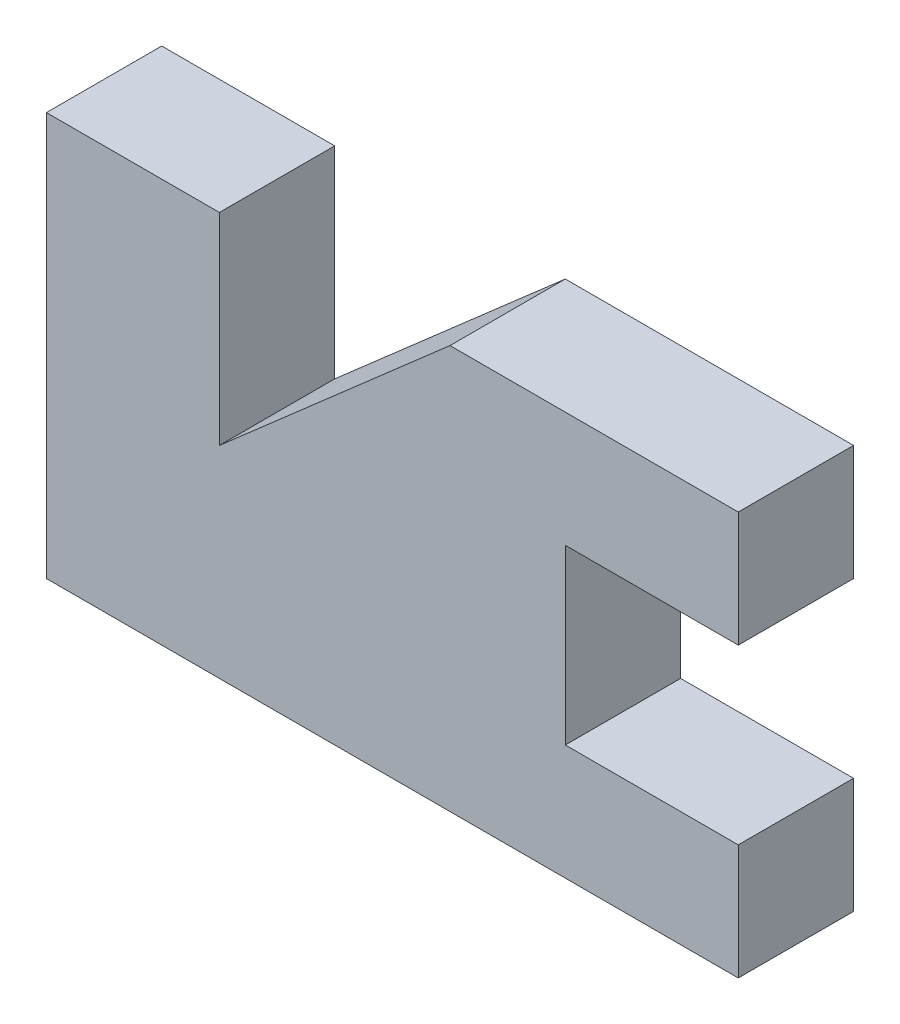
ISO-10303-21;
HEADER;
FILE_DESCRIPTION(('STEP AP214'),'2;1');
FILE_NAME('part.step','',(''),(''),'','','');
FILE_SCHEMA(('AUTOMOTIVE_DESIGN { 1 0 10303 214 1 1 1 1 }'));
ENDSEC;
DATA;
#1=APPLICATION_CONTEXT('core data for automotive mechanical design processes');
#2=APPLICATION_PROTOCOL_DEFINITION('international standard','automotive_design',2000,#1);
#3=PRODUCT_CONTEXT('',#1,'mechanical');
#4=PRODUCT('Part','Part','',(#3));
#5=PRODUCT_RELATED_PRODUCT_CATEGORY('part','',(#4));
#6=PRODUCT_DEFINITION_FORMATION('','',#4);
#7=PRODUCT_DEFINITION_CONTEXT('part definition',#1,'design');
#8=PRODUCT_DEFINITION('design','',#6,#7);
#9=PRODUCT_DEFINITION_SHAPE('','',#8);
#10=(LENGTH_UNIT() NAMED_UNIT(*) SI_UNIT(.MILLI.,.METRE.));
#11=(NAMED_UNIT(*) PLANE_ANGLE_UNIT() SI_UNIT($,.RADIAN.));
#12=(NAMED_UNIT(*) SI_UNIT($,.STERADIAN.) SOLID_ANGLE_UNIT());
#13=UNCERTAINTY_MEASURE_WITH_UNIT(LENGTH_MEASURE(1.E-05),#10,'distance_accuracy_value','');
#14=(GEOMETRIC_REPRESENTATION_CONTEXT(3) GLOBAL_UNCERTAINTY_ASSIGNED_CONTEXT((#13)) GLOBAL_UNIT_ASSIGNED_CONTEXT((#10,
#11,#12)) REPRESENTATION_CONTEXT('',''));
#15=CARTESIAN_POINT('',(0.,0.,0.));
#16=DIRECTION('',(0.,0.,1.));
#17=DIRECTION('',(1.,0.,0.));
#18=AXIS2_PLACEMENT_3D('',#15,#16,#17);
#19=CARTESIAN_POINT('',(300.,75.,100.));
#20=DIRECTION('',(-1.,0.,0.));
#21=DIRECTION('',(0.,0.,1.));
#22=AXIS2_PLACEMENT_3D('',#19,#20,#21);
#23=PLANE('',#22);
#24=DIRECTION('',(0.,1.,0.));
#25=VECTOR('',#24,1.);
#26=CARTESIAN_POINT('',(300.,75.,0.));
#27=LINE('',#26,#25);
#28=CARTESIAN_POINT('',(300.,75.,0.));
#29=VERTEX_POINT('',#28);
#30=CARTESIAN_POINT('',(300.,175.,0.));
#31=VERTEX_POINT('',#30);
#32=EDGE_CURVE('E147',#29,#31,#27,.T.);
#33=ORIENTED_EDGE('',*,*,#32,.T.);
#34=DIRECTION('',(0.,0.,-1.));
#35=VECTOR('',#34,1.);
#36=CARTESIAN_POINT('',(300.,175.,100.));
#37=LINE('',#36,#35);
#38=CARTESIAN_POINT('',(300.,175.,100.));
#39=VERTEX_POINT('',#38);
#40=EDGE_CURVE('E11',#39,#31,#37,.T.);
#41=ORIENTED_EDGE('',*,*,#40,.F.);
#42=DIRECTION('',(0.,1.,0.));
#43=VECTOR('',#42,1.);
#44=CARTESIAN_POINT('',(300.,75.,100.));
#45=LINE('',#44,#43);
#46=CARTESIAN_POINT('',(300.,75.,100.));
#47=VERTEX_POINT('',#46);
#48=EDGE_CURVE('E167',#47,#39,#45,.T.);
#49=ORIENTED_EDGE('',*,*,#48,.F.);
#50=DIRECTION('',(0.,0.,-1.));
#51=VECTOR('',#50,1.);
#52=CARTESIAN_POINT('',(300.,75.,100.));
#53=LINE('',#52,#51);
#54=EDGE_CURVE('E143',#47,#29,#53,.T.);
#55=ORIENTED_EDGE('',*,*,#54,.T.);
#56=EDGE_LOOP('',(#33,#41,#49,#55));
#57=FACE_BOUND('',#56,.T.);
#58=ADVANCED_FACE('F33',(#57),#23,.F.);
#59=CARTESIAN_POINT('',(50.0000000000001,175.,100.));
#60=DIRECTION('',(0.,-1.,0.));
#61=DIRECTION('',(0.,0.,-1.));
#62=AXIS2_PLACEMENT_3D('',#59,#60,#61);
#63=PLANE('',#62);
#64=DIRECTION('',(-1.,0.,0.));
#65=VECTOR('',#64,1.);
#66=CARTESIAN_POINT('',(50.0000000000001,175.,0.));
#67=LINE('',#66,#65);
#68=CARTESIAN_POINT('',(50.0000000000001,175.,0.));
#69=VERTEX_POINT('',#68);
#70=EDGE_CURVE('E150',#31,#69,#67,.T.);
#71=ORIENTED_EDGE('',*,*,#70,.T.);
#72=DIRECTION('',(0.,0.,-1.));
#73=VECTOR('',#72,1.);
#74=CARTESIAN_POINT('',(50.0000000000001,175.,100.));
#75=LINE('',#74,#73);
#76=CARTESIAN_POINT('',(50.0000000000001,175.,100.));
#77=VERTEX_POINT('',#76);
#78=EDGE_CURVE('E41',#77,#69,#75,.T.);
#79=ORIENTED_EDGE('',*,*,#78,.F.);
#80=DIRECTION('',(-1.,0.,0.));
#81=VECTOR('',#80,1.);
#82=CARTESIAN_POINT('',(50.0000000000001,175.,100.));
#83=LINE('',#82,#81);
#84=EDGE_CURVE('E101',#39,#77,#83,.T.);
#85=ORIENTED_EDGE('',*,*,#84,.F.);
#86=ORIENTED_EDGE('',*,*,#40,.T.);
#87=EDGE_LOOP('',(#71,#79,#85,#86));
#88=FACE_BOUND('',#87,.T.);
#89=ADVANCED_FACE('F239',(#88),#63,.F.);
#90=CARTESIAN_POINT('',(-150.,0.,100.));
#91=DIRECTION('',(0.658504607868518,-0.752576694706878,0.));
#92=DIRECTION('',(0.752576694706878,0.658504607868518,0.));
#93=AXIS2_PLACEMENT_3D('',#90,#91,#92);
#94=PLANE('',#93);
#95=DIRECTION('',(-0.752576694706878,-0.658504607868518,0.));
#96=VECTOR('',#95,1.);
#97=CARTESIAN_POINT('',(-150.,0.,0.));
#98=LINE('',#97,#96);
#99=CARTESIAN_POINT('',(-150.,0.,0.));
#100=VERTEX_POINT('',#99);
#101=EDGE_CURVE('E152',#69,#100,#98,.T.);
#102=ORIENTED_EDGE('',*,*,#101,.T.);
#103=DIRECTION('',(0.,0.,-1.));
#104=VECTOR('',#103,1.);
#105=CARTESIAN_POINT('',(-150.,0.,100.));
#106=LINE('',#105,#104);
#107=CARTESIAN_POINT('',(-150.,0.,100.));
#108=VERTEX_POINT('',#107);
#109=EDGE_CURVE('E183',#108,#100,#106,.T.);
#110=ORIENTED_EDGE('',*,*,#109,.F.);
#111=DIRECTION('',(-0.752576694706878,-0.658504607868518,0.));
#112=VECTOR('',#111,1.);
#113=CARTESIAN_POINT('',(-150.,0.,100.));
#114=LINE('',#113,#112);
#115=EDGE_CURVE('E191',#77,#108,#114,.T.);
#116=ORIENTED_EDGE('',*,*,#115,.F.);
#117=ORIENTED_EDGE('',*,*,#78,.T.);
#118=EDGE_LOOP('',(#102,#110,#116,#117));
#119=FACE_BOUND('',#118,.T.);
#120=ADVANCED_FACE('F189',(#119),#94,.F.);
#121=CARTESIAN_POINT('',(-150.,175.,100.));
#122=DIRECTION('',(-1.,0.,0.));
#123=DIRECTION('',(0.,-1.,0.));
#124=AXIS2_PLACEMENT_3D('',#121,#122,#123);
#125=PLANE('',#124);
#126=DIRECTION('',(0.,1.,0.));
#127=VECTOR('',#126,1.);
#128=CARTESIAN_POINT('',(-150.,175.,0.));
#129=LINE('',#128,#127);
#130=CARTESIAN_POINT('',(-150.,175.,0.));
#131=VERTEX_POINT('',#130);
#132=EDGE_CURVE('E154',#100,#131,#129,.T.);
#133=ORIENTED_EDGE('',*,*,#132,.T.);
#134=DIRECTION('',(0.,0.,-1.));
#135=VECTOR('',#134,1.);
#136=CARTESIAN_POINT('',(-150.,175.,100.));
#137=LINE('',#136,#135);
#138=CARTESIAN_POINT('',(-150.,175.,100.));
#139=VERTEX_POINT('',#138);
#140=EDGE_CURVE('E180',#139,#131,#137,.T.);
#141=ORIENTED_EDGE('',*,*,#140,.F.);
#142=DIRECTION('',(0.,1.,0.));
#143=VECTOR('',#142,1.);
#144=CARTESIAN_POINT('',(-150.,175.,100.));
#145=LINE('',#144,#143);
#146=EDGE_CURVE('E209',#108,#139,#145,.T.);
#147=ORIENTED_EDGE('',*,*,#146,.F.);
#148=ORIENTED_EDGE('',*,*,#109,.T.);
#149=EDGE_LOOP('',(#133,#141,#147,#148));
#150=FACE_BOUND('',#149,.T.);
#151=ADVANCED_FACE('F200',(#150),#125,.F.);
#152=CARTESIAN_POINT('',(-300.,175.,100.));
#153=DIRECTION('',(0.,-1.,0.));
#154=DIRECTION('',(0.,0.,-1.));
#155=AXIS2_PLACEMENT_3D('',#152,#153,#154);
#156=PLANE('',#155);
#157=DIRECTION('',(-1.,0.,0.));
#158=VECTOR('',#157,1.);
#159=CARTESIAN_POINT('',(-300.,175.,0.));
#160=LINE('',#159,#158);
#161=CARTESIAN_POINT('',(-300.,175.,0.));
#162=VERTEX_POINT('',#161);
#163=EDGE_CURVE('E156',#131,#162,#160,.T.);
#164=ORIENTED_EDGE('',*,*,#163,.T.);
#165=DIRECTION('',(0.,0.,-1.));
#166=VECTOR('',#165,1.);
#167=CARTESIAN_POINT('',(-300.,175.,100.));
#168=LINE('',#167,#166);
#169=CARTESIAN_POINT('',(-300.,175.,100.));
#170=VERTEX_POINT('',#169);
#171=EDGE_CURVE('E177',#170,#162,#168,.T.);
#172=ORIENTED_EDGE('',*,*,#171,.F.);
#173=DIRECTION('',(-1.,0.,0.));
#174=VECTOR('',#173,1.);
#175=CARTESIAN_POINT('',(-300.,175.,100.));
#176=LINE('',#175,#174);
#177=EDGE_CURVE('E206',#139,#170,#176,.T.);
#178=ORIENTED_EDGE('',*,*,#177,.F.);
#179=ORIENTED_EDGE('',*,*,#140,.T.);
#180=EDGE_LOOP('',(#164,#172,#178,#179));
#181=FACE_BOUND('',#180,.T.);
#182=ADVANCED_FACE('F204',(#181),#156,.F.);
#183=CARTESIAN_POINT('',(-300.,-175.,100.));
#184=DIRECTION('',(1.,0.,0.));
#185=DIRECTION('',(0.,0.,-1.));
#186=AXIS2_PLACEMENT_3D('',#183,#184,#185);
#187=PLANE('',#186);
#188=DIRECTION('',(0.,-1.,0.));
#189=VECTOR('',#188,1.);
#190=CARTESIAN_POINT('',(-300.,-175.,0.));
#191=LINE('',#190,#189);
#192=CARTESIAN_POINT('',(-300.,-175.,0.));
#193=VERTEX_POINT('',#192);
#194=EDGE_CURVE('E158',#162,#193,#191,.T.);
#195=ORIENTED_EDGE('',*,*,#194,.T.);
#196=DIRECTION('',(0.,0.,-1.));
#197=VECTOR('',#196,1.);
#198=CARTESIAN_POINT('',(-300.,-175.,100.));
#199=LINE('',#198,#197);
#200=CARTESIAN_POINT('',(-300.,-175.,100.));
#201=VERTEX_POINT('',#200);
#202=EDGE_CURVE('E174',#201,#193,#199,.T.);
#203=ORIENTED_EDGE('',*,*,#202,.F.);
#204=DIRECTION('',(0.,-1.,0.));
#205=VECTOR('',#204,1.);
#206=CARTESIAN_POINT('',(-300.,-175.,100.));
#207=LINE('',#206,#205);
#208=EDGE_CURVE('E208',#170,#201,#207,.T.);
#209=ORIENTED_EDGE('',*,*,#208,.F.);
#210=ORIENTED_EDGE('',*,*,#171,.T.);
#211=EDGE_LOOP('',(#195,#203,#209,#210));
#212=FACE_BOUND('',#211,.T.);
#213=ADVANCED_FACE('F252',(#212),#187,.F.);
#214=CARTESIAN_POINT('',(-300.,-175.,100.));
#215=DIRECTION('',(0.,1.,0.));
#216=DIRECTION('',(0.,0.,1.));
#217=AXIS2_PLACEMENT_3D('',#214,#215,#216);
#218=PLANE('',#217);
#219=DIRECTION('',(1.,0.,0.));
#220=VECTOR('',#219,1.);
#221=CARTESIAN_POINT('',(-300.,-175.,0.));
#222=LINE('',#221,#220);
#223=CARTESIAN_POINT('',(300.,-175.,0.));
#224=VERTEX_POINT('',#223);
#225=EDGE_CURVE('E160',#193,#224,#222,.T.);
#226=ORIENTED_EDGE('',*,*,#225,.T.);
#227=DIRECTION('',(0.,0.,-1.));
#228=VECTOR('',#227,1.);
#229=CARTESIAN_POINT('',(300.,-175.,100.));
#230=LINE('',#229,#228);
#231=CARTESIAN_POINT('',(300.,-175.,100.));
#232=VERTEX_POINT('',#231);
#233=EDGE_CURVE('E171',#232,#224,#230,.T.);
#234=ORIENTED_EDGE('',*,*,#233,.F.);
#235=DIRECTION('',(1.,0.,0.));
#236=VECTOR('',#235,1.);
#237=CARTESIAN_POINT('',(-300.,-175.,100.));
#238=LINE('',#237,#236);
#239=EDGE_CURVE('E211',#201,#232,#238,.T.);
#240=ORIENTED_EDGE('',*,*,#239,.F.);
#241=ORIENTED_EDGE('',*,*,#202,.T.);
#242=EDGE_LOOP('',(#226,#234,#240,#241));
#243=FACE_BOUND('',#242,.T.);
#244=ADVANCED_FACE('F220',(#243),#218,.F.);
#245=CARTESIAN_POINT('',(300.,-175.,100.));
#246=DIRECTION('',(-1.,0.,0.));
#247=DIRECTION('',(0.,0.,1.));
#248=AXIS2_PLACEMENT_3D('',#245,#246,#247);
#249=PLANE('',#248);
#250=DIRECTION('',(0.,1.,0.));
#251=VECTOR('',#250,1.);
#252=CARTESIAN_POINT('',(300.,-175.,0.));
#253=LINE('',#252,#251);
#254=CARTESIAN_POINT('',(300.,-75.,0.));
#255=VERTEX_POINT('',#254);
#256=EDGE_CURVE('E162',#224,#255,#253,.T.);
#257=ORIENTED_EDGE('',*,*,#256,.T.);
#258=DIRECTION('',(0.,0.,-1.));
#259=VECTOR('',#258,1.);
#260=CARTESIAN_POINT('',(300.,-75.,100.));
#261=LINE('',#260,#259);
#262=CARTESIAN_POINT('',(300.,-75.,100.));
#263=VERTEX_POINT('',#262);
#264=EDGE_CURVE('E138',#263,#255,#261,.T.);
#265=ORIENTED_EDGE('',*,*,#264,.F.);
#266=DIRECTION('',(0.,1.,0.));
#267=VECTOR('',#266,1.);
#268=CARTESIAN_POINT('',(300.,-175.,100.));
#269=LINE('',#268,#267);
#270=EDGE_CURVE('E129',#232,#263,#269,.T.);
#271=ORIENTED_EDGE('',*,*,#270,.F.);
#272=ORIENTED_EDGE('',*,*,#233,.T.);
#273=EDGE_LOOP('',(#257,#265,#271,#272));
#274=FACE_BOUND('',#273,.T.);
#275=ADVANCED_FACE('F224',(#274),#249,.F.);
#276=CARTESIAN_POINT('',(150.,-75.,100.));
#277=DIRECTION('',(0.,-1.,0.));
#278=DIRECTION('',(0.,0.,-1.));
#279=AXIS2_PLACEMENT_3D('',#276,#277,#278);
#280=PLANE('',#279);
#281=DIRECTION('',(-1.,0.,0.));
#282=VECTOR('',#281,1.);
#283=CARTESIAN_POINT('',(150.,-75.,0.));
#284=LINE('',#283,#282);
#285=CARTESIAN_POINT('',(150.,-75.,0.));
#286=VERTEX_POINT('',#285);
#287=EDGE_CURVE('E137',#255,#286,#284,.T.);
#288=ORIENTED_EDGE('',*,*,#287,.T.);
#289=DIRECTION('',(0.,0.,-1.));
#290=VECTOR('',#289,1.);
#291=CARTESIAN_POINT('',(150.,-75.,100.));
#292=LINE('',#291,#290);
#293=CARTESIAN_POINT('',(150.,-75.,100.));
#294=VERTEX_POINT('',#293);
#295=EDGE_CURVE('E134',#294,#286,#292,.T.);
#296=ORIENTED_EDGE('',*,*,#295,.F.);
#297=DIRECTION('',(-1.,0.,0.));
#298=VECTOR('',#297,1.);
#299=CARTESIAN_POINT('',(150.,-75.,100.));
#300=LINE('',#299,#298);
#301=EDGE_CURVE('E123',#263,#294,#300,.T.);
#302=ORIENTED_EDGE('',*,*,#301,.F.);
#303=ORIENTED_EDGE('',*,*,#264,.T.);
#304=EDGE_LOOP('',(#288,#296,#302,#303));
#305=FACE_BOUND('',#304,.T.);
#306=ADVANCED_FACE('F135',(#305),#280,.F.);
#307=CARTESIAN_POINT('',(150.,75.,100.));
#308=DIRECTION('',(-1.,0.,0.));
#309=DIRECTION('',(0.,-1.,0.));
#310=AXIS2_PLACEMENT_3D('',#307,#308,#309);
#311=PLANE('',#310);
#312=DIRECTION('',(0.,1.,0.));
#313=VECTOR('',#312,1.);
#314=CARTESIAN_POINT('',(150.,75.,0.));
#315=LINE('',#314,#313);
#316=CARTESIAN_POINT('',(150.,75.,0.));
#317=VERTEX_POINT('',#316);
#318=EDGE_CURVE('E87',#286,#317,#315,.T.);
#319=ORIENTED_EDGE('',*,*,#318,.T.);
#320=DIRECTION('',(0.,0.,-1.));
#321=VECTOR('',#320,1.);
#322=CARTESIAN_POINT('',(150.,75.,100.));
#323=LINE('',#322,#321);
#324=CARTESIAN_POINT('',(150.,75.,100.));
#325=VERTEX_POINT('',#324);
#326=EDGE_CURVE('E139',#325,#317,#323,.T.);
#327=ORIENTED_EDGE('',*,*,#326,.F.);
#328=DIRECTION('',(0.,1.,0.));
#329=VECTOR('',#328,1.);
#330=CARTESIAN_POINT('',(150.,75.,100.));
#331=LINE('',#330,#329);
#332=EDGE_CURVE('E127',#294,#325,#331,.T.);
#333=ORIENTED_EDGE('',*,*,#332,.F.);
#334=ORIENTED_EDGE('',*,*,#295,.T.);
#335=EDGE_LOOP('',(#319,#327,#333,#334));
#336=FACE_BOUND('',#335,.T.);
#337=ADVANCED_FACE('F141',(#336),#311,.F.);
#338=CARTESIAN_POINT('',(300.,75.,100.));
#339=DIRECTION('',(0.,1.,0.));
#340=DIRECTION('',(0.,0.,1.));
#341=AXIS2_PLACEMENT_3D('',#338,#339,#340);
#342=PLANE('',#341);
#343=DIRECTION('',(1.,0.,0.));
#344=VECTOR('',#343,1.);
#345=CARTESIAN_POINT('',(300.,75.,0.));
#346=LINE('',#345,#344);
#347=EDGE_CURVE('E93',#317,#29,#346,.T.);
#348=ORIENTED_EDGE('',*,*,#347,.T.);
#349=ORIENTED_EDGE('',*,*,#54,.F.);
#350=DIRECTION('',(1.,0.,0.));
#351=VECTOR('',#350,1.);
#352=CARTESIAN_POINT('',(300.,75.,100.));
#353=LINE('',#352,#351);
#354=EDGE_CURVE('E49',#325,#47,#353,.T.);
#355=ORIENTED_EDGE('',*,*,#354,.F.);
#356=ORIENTED_EDGE('',*,*,#326,.T.);
#357=EDGE_LOOP('',(#348,#349,#355,#356));
#358=FACE_BOUND('',#357,.T.);
#359=ADVANCED_FACE('F228',(#358),#342,.F.);
#360=CARTESIAN_POINT('',(0.,0.,100.));
#361=DIRECTION('',(0.,0.,-1.));
#362=DIRECTION('',(-1.,0.,0.));
#363=AXIS2_PLACEMENT_3D('',#360,#361,#362);
#364=PLANE('',#363);
#365=ORIENTED_EDGE('',*,*,#48,.T.);
#366=ORIENTED_EDGE('',*,*,#84,.T.);
#367=ORIENTED_EDGE('',*,*,#115,.T.);
#368=ORIENTED_EDGE('',*,*,#146,.T.);
#369=ORIENTED_EDGE('',*,*,#177,.T.);
#370=ORIENTED_EDGE('',*,*,#208,.T.);
#371=ORIENTED_EDGE('',*,*,#239,.T.);
#372=ORIENTED_EDGE('',*,*,#270,.T.);
#373=ORIENTED_EDGE('',*,*,#301,.T.);
#374=ORIENTED_EDGE('',*,*,#332,.T.);
#375=ORIENTED_EDGE('',*,*,#354,.T.);
#376=EDGE_LOOP('',(#365,#366,#367,#368,#369,#370,#371,#372,#373,#374,#375));
#377=FACE_BOUND('',#376,.T.);
#378=ADVANCED_FACE('F125',(#377),#364,.F.);
#379=CARTESIAN_POINT('',(0.,0.,0.));
#380=DIRECTION('',(0.,0.,-1.));
#381=DIRECTION('',(-1.,0.,0.));
#382=AXIS2_PLACEMENT_3D('',#379,#380,#381);
#383=PLANE('',#382);
#384=ORIENTED_EDGE('',*,*,#32,.F.);
#385=ORIENTED_EDGE('',*,*,#347,.F.);
#386=ORIENTED_EDGE('',*,*,#318,.F.);
#387=ORIENTED_EDGE('',*,*,#287,.F.);
#388=ORIENTED_EDGE('',*,*,#256,.F.);
#389=ORIENTED_EDGE('',*,*,#225,.F.);
#390=ORIENTED_EDGE('',*,*,#194,.F.);
#391=ORIENTED_EDGE('',*,*,#163,.F.);
#392=ORIENTED_EDGE('',*,*,#132,.F.);
#393=ORIENTED_EDGE('',*,*,#101,.F.);
#394=ORIENTED_EDGE('',*,*,#70,.F.);
#395=EDGE_LOOP('',(#384,#385,#386,#387,#388,#389,#390,#391,#392,#393,#394));
#396=FACE_BOUND('',#395,.T.);
#397=ADVANCED_FACE('F195',(#396),#383,.T.);
#398=CLOSED_SHELL('',(#58,#89,#120,#151,#182,#213,#244,#275,#306,#337,#359,#378,#397));
#399=MANIFOLD_SOLID_BREP('B2',#398);
#400=ADVANCED_BREP_SHAPE_REPRESENTATION('',(#18,#399),#14);
#401=SHAPE_DEFINITION_REPRESENTATION(#9,#400);
ENDSEC;
END-ISO-10303-21;
